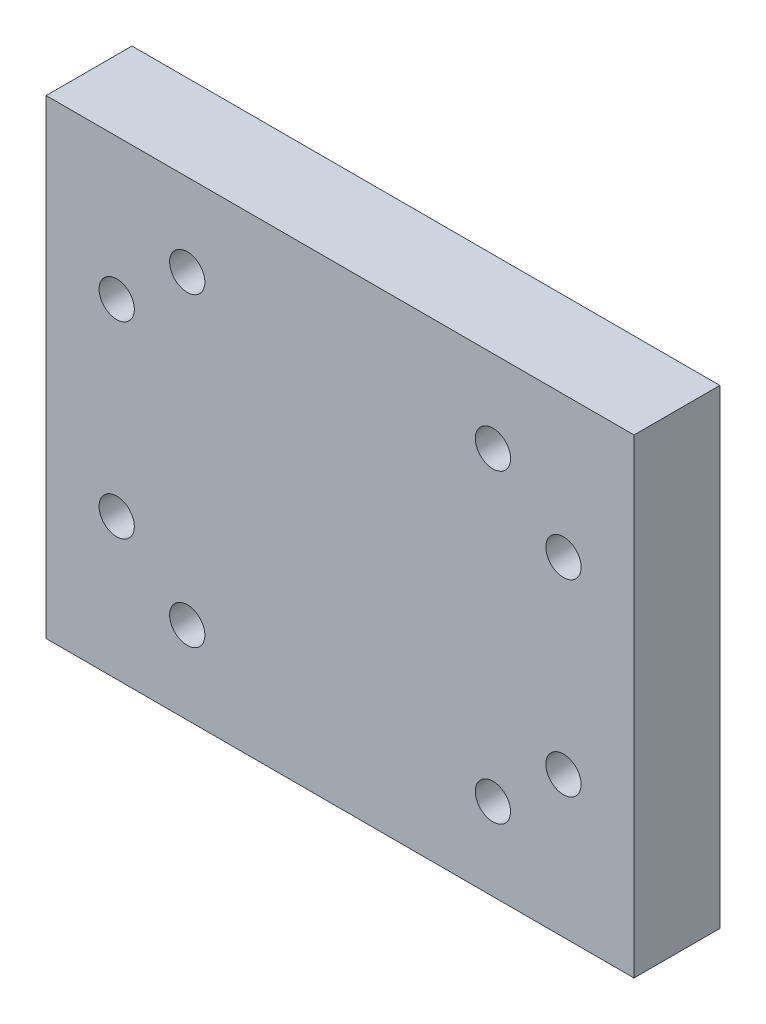
ISO-10303-21;
HEADER;
FILE_DESCRIPTION(('STEP AP214'),'2;1');
FILE_NAME('part.step','',(''),(''),'','','');
FILE_SCHEMA(('AUTOMOTIVE_DESIGN { 1 0 10303 214 1 1 1 1 }'));
ENDSEC;
DATA;
#1=APPLICATION_CONTEXT('core data for automotive mechanical design processes');
#2=APPLICATION_PROTOCOL_DEFINITION('international standard','automotive_design',2000,#1);
#3=PRODUCT_CONTEXT('',#1,'mechanical');
#4=PRODUCT('Part','Part','',(#3));
#5=PRODUCT_RELATED_PRODUCT_CATEGORY('part','',(#4));
#6=PRODUCT_DEFINITION_FORMATION('','',#4);
#7=PRODUCT_DEFINITION_CONTEXT('part definition',#1,'design');
#8=PRODUCT_DEFINITION('design','',#6,#7);
#9=PRODUCT_DEFINITION_SHAPE('','',#8);
#10=(LENGTH_UNIT() NAMED_UNIT(*) SI_UNIT(.MILLI.,.METRE.));
#11=(NAMED_UNIT(*) PLANE_ANGLE_UNIT() SI_UNIT($,.RADIAN.));
#12=(NAMED_UNIT(*) SI_UNIT($,.STERADIAN.) SOLID_ANGLE_UNIT());
#13=UNCERTAINTY_MEASURE_WITH_UNIT(LENGTH_MEASURE(1.E-05),#10,'distance_accuracy_value','');
#14=(GEOMETRIC_REPRESENTATION_CONTEXT(3) GLOBAL_UNCERTAINTY_ASSIGNED_CONTEXT((#13)) GLOBAL_UNIT_ASSIGNED_CONTEXT((#10,
#11,#12)) REPRESENTATION_CONTEXT('',''));
#15=CARTESIAN_POINT('',(0.,0.,0.));
#16=DIRECTION('',(0.,0.,1.));
#17=DIRECTION('',(1.,0.,0.));
#18=AXIS2_PLACEMENT_3D('',#15,#16,#17);
#19=CARTESIAN_POINT('',(0.,0.,7.3));
#20=DIRECTION('',(0.,0.,1.));
#21=DIRECTION('',(1.,0.,0.));
#22=AXIS2_PLACEMENT_3D('',#19,#20,#21);
#23=PLANE('',#22);
#24=CARTESIAN_POINT('',(-19.,-8.,7.3));
#25=DIRECTION('',(0.,0.,1.));
#26=DIRECTION('',(1.,0.,0.));
#27=AXIS2_PLACEMENT_3D('',#24,#25,#26);
#28=CIRCLE('',#27,1.5);
#29=CARTESIAN_POINT('',(-17.5,-8.,7.3));
#30=VERTEX_POINT('',#29);
#31=EDGE_CURVE('E133',#30,#30,#28,.T.);
#32=ORIENTED_EDGE('',*,*,#31,.F.);
#33=EDGE_LOOP('',(#32));
#34=FACE_BOUND('',#33,.T.);
#35=CARTESIAN_POINT('',(19.,-8.,7.3));
#36=DIRECTION('',(0.,0.,1.));
#37=DIRECTION('',(1.,0.,0.));
#38=AXIS2_PLACEMENT_3D('',#35,#36,#37);
#39=CIRCLE('',#38,1.5);
#40=CARTESIAN_POINT('',(20.5,-8.,7.3));
#41=VERTEX_POINT('',#40);
#42=EDGE_CURVE('E138',#41,#41,#39,.T.);
#43=ORIENTED_EDGE('',*,*,#42,.F.);
#44=EDGE_LOOP('',(#43));
#45=FACE_BOUND('',#44,.T.);
#46=CARTESIAN_POINT('',(19.,8.,7.3));
#47=DIRECTION('',(0.,0.,1.));
#48=DIRECTION('',(1.,0.,0.));
#49=AXIS2_PLACEMENT_3D('',#46,#47,#48);
#50=CIRCLE('',#49,1.5);
#51=CARTESIAN_POINT('',(20.5,8.,7.3));
#52=VERTEX_POINT('',#51);
#53=EDGE_CURVE('E141',#52,#52,#50,.T.);
#54=ORIENTED_EDGE('',*,*,#53,.F.);
#55=EDGE_LOOP('',(#54));
#56=FACE_BOUND('',#55,.T.);
#57=CARTESIAN_POINT('',(-19.,8.,7.3));
#58=DIRECTION('',(0.,0.,1.));
#59=DIRECTION('',(1.,0.,0.));
#60=AXIS2_PLACEMENT_3D('',#57,#58,#59);
#61=CIRCLE('',#60,1.5);
#62=CARTESIAN_POINT('',(-17.5,8.,7.3));
#63=VERTEX_POINT('',#62);
#64=EDGE_CURVE('E144',#63,#63,#61,.T.);
#65=ORIENTED_EDGE('',*,*,#64,.F.);
#66=EDGE_LOOP('',(#65));
#67=FACE_BOUND('',#66,.T.);
#68=CARTESIAN_POINT('',(13.,-13.,7.3));
#69=DIRECTION('',(0.,0.,1.));
#70=DIRECTION('',(1.,0.,0.));
#71=AXIS2_PLACEMENT_3D('',#68,#69,#70);
#72=CIRCLE('',#71,1.5);
#73=CARTESIAN_POINT('',(14.5,-13.,7.3));
#74=VERTEX_POINT('',#73);
#75=EDGE_CURVE('E121',#74,#74,#72,.T.);
#76=ORIENTED_EDGE('',*,*,#75,.F.);
#77=EDGE_LOOP('',(#76));
#78=FACE_BOUND('',#77,.T.);
#79=CARTESIAN_POINT('',(-13.,13.,7.3));
#80=DIRECTION('',(0.,0.,1.));
#81=DIRECTION('',(1.,0.,0.));
#82=AXIS2_PLACEMENT_3D('',#79,#80,#81);
#83=CIRCLE('',#82,1.5);
#84=CARTESIAN_POINT('',(-11.5,13.,7.3));
#85=VERTEX_POINT('',#84);
#86=EDGE_CURVE('E100',#85,#85,#83,.T.);
#87=ORIENTED_EDGE('',*,*,#86,.F.);
#88=EDGE_LOOP('',(#87));
#89=FACE_BOUND('',#88,.T.);
#90=DIRECTION('',(0.,-1.,0.));
#91=VECTOR('',#90,1.);
#92=CARTESIAN_POINT('',(-25.,-20.,7.3));
#93=LINE('',#92,#91);
#94=CARTESIAN_POINT('',(-25.,20.,7.3));
#95=VERTEX_POINT('',#94);
#96=CARTESIAN_POINT('',(-25.,-20.,7.3));
#97=VERTEX_POINT('',#96);
#98=EDGE_CURVE('E85',#95,#97,#93,.T.);
#99=ORIENTED_EDGE('',*,*,#98,.T.);
#100=DIRECTION('',(1.,0.,0.));
#101=VECTOR('',#100,1.);
#102=CARTESIAN_POINT('',(25.,-20.,7.3));
#103=LINE('',#102,#101);
#104=CARTESIAN_POINT('',(25.,-20.,7.3));
#105=VERTEX_POINT('',#104);
#106=EDGE_CURVE('E80',#97,#105,#103,.T.);
#107=ORIENTED_EDGE('',*,*,#106,.T.);
#108=DIRECTION('',(0.,1.,0.));
#109=VECTOR('',#108,1.);
#110=CARTESIAN_POINT('',(25.,-20.,7.3));
#111=LINE('',#110,#109);
#112=CARTESIAN_POINT('',(25.,20.,7.3));
#113=VERTEX_POINT('',#112);
#114=EDGE_CURVE('E83',#105,#113,#111,.T.);
#115=ORIENTED_EDGE('',*,*,#114,.T.);
#116=DIRECTION('',(-1.,0.,0.));
#117=VECTOR('',#116,1.);
#118=CARTESIAN_POINT('',(25.,20.,7.3));
#119=LINE('',#118,#117);
#120=EDGE_CURVE('E50',#113,#95,#119,.T.);
#121=ORIENTED_EDGE('',*,*,#120,.T.);
#122=EDGE_LOOP('',(#99,#107,#115,#121));
#123=FACE_BOUND('',#122,.T.);
#124=CARTESIAN_POINT('',(13.,13.,7.3));
#125=DIRECTION('',(0.,0.,1.));
#126=DIRECTION('',(-1.,0.,0.));
#127=AXIS2_PLACEMENT_3D('',#124,#125,#126);
#128=CIRCLE('',#127,1.5);
#129=CARTESIAN_POINT('',(11.5,13.,7.3));
#130=VERTEX_POINT('',#129);
#131=EDGE_CURVE('E115',#130,#130,#128,.T.);
#132=ORIENTED_EDGE('',*,*,#131,.F.);
#133=EDGE_LOOP('',(#132));
#134=FACE_BOUND('',#133,.T.);
#135=CARTESIAN_POINT('',(-13.,-13.,7.3));
#136=DIRECTION('',(0.,0.,1.));
#137=DIRECTION('',(-1.,0.,0.));
#138=AXIS2_PLACEMENT_3D('',#135,#136,#137);
#139=CIRCLE('',#138,1.5);
#140=CARTESIAN_POINT('',(-14.5,-13.,7.3));
#141=VERTEX_POINT('',#140);
#142=EDGE_CURVE('E127',#141,#141,#139,.T.);
#143=ORIENTED_EDGE('',*,*,#142,.F.);
#144=EDGE_LOOP('',(#143));
#145=FACE_BOUND('',#144,.T.);
#146=ADVANCED_FACE('F33',(#34,#45,#56,#67,#78,#89,#123,#134,#145),#23,.T.);
#147=CARTESIAN_POINT('',(0.,0.,0.));
#148=DIRECTION('',(0.,0.,1.));
#149=DIRECTION('',(1.,0.,0.));
#150=AXIS2_PLACEMENT_3D('',#147,#148,#149);
#151=PLANE('',#150);
#152=CARTESIAN_POINT('',(-19.,-8.,0.));
#153=DIRECTION('',(0.,0.,1.));
#154=DIRECTION('',(-1.,0.,0.));
#155=AXIS2_PLACEMENT_3D('',#152,#153,#154);
#156=CIRCLE('',#155,1.5);
#157=CARTESIAN_POINT('',(-20.5,-8.,0.));
#158=VERTEX_POINT('',#157);
#159=EDGE_CURVE('E151',#158,#158,#156,.T.);
#160=ORIENTED_EDGE('',*,*,#159,.T.);
#161=EDGE_LOOP('',(#160));
#162=FACE_BOUND('',#161,.T.);
#163=CARTESIAN_POINT('',(19.,-8.,0.));
#164=DIRECTION('',(0.,0.,1.));
#165=DIRECTION('',(1.,0.,0.));
#166=AXIS2_PLACEMENT_3D('',#163,#164,#165);
#167=CIRCLE('',#166,1.5);
#168=CARTESIAN_POINT('',(20.5,-8.,0.));
#169=VERTEX_POINT('',#168);
#170=EDGE_CURVE('E154',#169,#169,#167,.T.);
#171=ORIENTED_EDGE('',*,*,#170,.T.);
#172=EDGE_LOOP('',(#171));
#173=FACE_BOUND('',#172,.T.);
#174=CARTESIAN_POINT('',(19.,8.,0.));
#175=DIRECTION('',(0.,0.,1.));
#176=DIRECTION('',(-1.,0.,0.));
#177=AXIS2_PLACEMENT_3D('',#174,#175,#176);
#178=CIRCLE('',#177,1.5);
#179=CARTESIAN_POINT('',(17.5,8.,0.));
#180=VERTEX_POINT('',#179);
#181=EDGE_CURVE('E150',#180,#180,#178,.T.);
#182=ORIENTED_EDGE('',*,*,#181,.T.);
#183=EDGE_LOOP('',(#182));
#184=FACE_BOUND('',#183,.T.);
#185=CARTESIAN_POINT('',(-19.,8.,0.));
#186=DIRECTION('',(0.,0.,1.));
#187=DIRECTION('',(1.,0.,0.));
#188=AXIS2_PLACEMENT_3D('',#185,#186,#187);
#189=CIRCLE('',#188,1.5);
#190=CARTESIAN_POINT('',(-17.5,8.,0.));
#191=VERTEX_POINT('',#190);
#192=EDGE_CURVE('E147',#191,#191,#189,.T.);
#193=ORIENTED_EDGE('',*,*,#192,.T.);
#194=EDGE_LOOP('',(#193));
#195=FACE_BOUND('',#194,.T.);
#196=DIRECTION('',(0.,-1.,0.));
#197=VECTOR('',#196,1.);
#198=CARTESIAN_POINT('',(-25.,-20.,0.));
#199=LINE('',#198,#197);
#200=CARTESIAN_POINT('',(-25.,20.,0.));
#201=VERTEX_POINT('',#200);
#202=CARTESIAN_POINT('',(-25.,-20.,0.));
#203=VERTEX_POINT('',#202);
#204=EDGE_CURVE('E97',#201,#203,#199,.T.);
#205=ORIENTED_EDGE('',*,*,#204,.F.);
#206=DIRECTION('',(-1.,0.,0.));
#207=VECTOR('',#206,1.);
#208=CARTESIAN_POINT('',(25.,20.,0.));
#209=LINE('',#208,#207);
#210=CARTESIAN_POINT('',(25.,20.,0.));
#211=VERTEX_POINT('',#210);
#212=EDGE_CURVE('E73',#211,#201,#209,.T.);
#213=ORIENTED_EDGE('',*,*,#212,.F.);
#214=DIRECTION('',(0.,1.,0.));
#215=VECTOR('',#214,1.);
#216=CARTESIAN_POINT('',(25.,-20.,0.));
#217=LINE('',#216,#215);
#218=CARTESIAN_POINT('',(25.,-20.,0.));
#219=VERTEX_POINT('',#218);
#220=EDGE_CURVE('E67',#219,#211,#217,.T.);
#221=ORIENTED_EDGE('',*,*,#220,.F.);
#222=DIRECTION('',(1.,0.,0.));
#223=VECTOR('',#222,1.);
#224=CARTESIAN_POINT('',(25.,-20.,0.));
#225=LINE('',#224,#223);
#226=EDGE_CURVE('E89',#203,#219,#225,.T.);
#227=ORIENTED_EDGE('',*,*,#226,.F.);
#228=EDGE_LOOP('',(#205,#213,#221,#227));
#229=FACE_BOUND('',#228,.T.);
#230=CARTESIAN_POINT('',(-13.,13.,0.));
#231=DIRECTION('',(0.,0.,1.));
#232=DIRECTION('',(1.,0.,0.));
#233=AXIS2_PLACEMENT_3D('',#230,#231,#232);
#234=CIRCLE('',#233,1.5);
#235=CARTESIAN_POINT('',(-11.5,13.,0.));
#236=VERTEX_POINT('',#235);
#237=EDGE_CURVE('E112',#236,#236,#234,.T.);
#238=ORIENTED_EDGE('',*,*,#237,.T.);
#239=EDGE_LOOP('',(#238));
#240=FACE_BOUND('',#239,.T.);
#241=CARTESIAN_POINT('',(13.,13.,0.));
#242=DIRECTION('',(0.,0.,1.));
#243=DIRECTION('',(-1.,0.,0.));
#244=AXIS2_PLACEMENT_3D('',#241,#242,#243);
#245=CIRCLE('',#244,1.5);
#246=CARTESIAN_POINT('',(11.5,13.,0.));
#247=VERTEX_POINT('',#246);
#248=EDGE_CURVE('E118',#247,#247,#245,.T.);
#249=ORIENTED_EDGE('',*,*,#248,.T.);
#250=EDGE_LOOP('',(#249));
#251=FACE_BOUND('',#250,.T.);
#252=CARTESIAN_POINT('',(13.,-13.,0.));
#253=DIRECTION('',(0.,0.,1.));
#254=DIRECTION('',(1.,0.,0.));
#255=AXIS2_PLACEMENT_3D('',#252,#253,#254);
#256=CIRCLE('',#255,1.5);
#257=CARTESIAN_POINT('',(14.5,-13.,0.));
#258=VERTEX_POINT('',#257);
#259=EDGE_CURVE('E124',#258,#258,#256,.T.);
#260=ORIENTED_EDGE('',*,*,#259,.T.);
#261=EDGE_LOOP('',(#260));
#262=FACE_BOUND('',#261,.T.);
#263=CARTESIAN_POINT('',(-13.,-13.,0.));
#264=DIRECTION('',(0.,0.,1.));
#265=DIRECTION('',(-1.,0.,0.));
#266=AXIS2_PLACEMENT_3D('',#263,#264,#265);
#267=CIRCLE('',#266,1.5);
#268=CARTESIAN_POINT('',(-14.5,-13.,0.));
#269=VERTEX_POINT('',#268);
#270=EDGE_CURVE('E130',#269,#269,#267,.T.);
#271=ORIENTED_EDGE('',*,*,#270,.T.);
#272=EDGE_LOOP('',(#271));
#273=FACE_BOUND('',#272,.T.);
#274=ADVANCED_FACE('F108',(#162,#173,#184,#195,#229,#240,#251,#262,#273),#151,.F.);
#275=CARTESIAN_POINT('',(-25.,-20.,7.3));
#276=DIRECTION('',(1.,0.,0.));
#277=DIRECTION('',(0.,1.,0.));
#278=AXIS2_PLACEMENT_3D('',#275,#276,#277);
#279=PLANE('',#278);
#280=ORIENTED_EDGE('',*,*,#204,.T.);
#281=DIRECTION('',(0.,0.,-1.));
#282=VECTOR('',#281,1.);
#283=CARTESIAN_POINT('',(-25.,-20.,7.3));
#284=LINE('',#283,#282);
#285=EDGE_CURVE('E11',#97,#203,#284,.T.);
#286=ORIENTED_EDGE('',*,*,#285,.F.);
#287=ORIENTED_EDGE('',*,*,#98,.F.);
#288=DIRECTION('',(0.,0.,-1.));
#289=VECTOR('',#288,1.);
#290=CARTESIAN_POINT('',(-25.,20.,7.3));
#291=LINE('',#290,#289);
#292=EDGE_CURVE('E93',#95,#201,#291,.T.);
#293=ORIENTED_EDGE('',*,*,#292,.T.);
#294=EDGE_LOOP('',(#280,#286,#287,#293));
#295=FACE_BOUND('',#294,.T.);
#296=ADVANCED_FACE('F35',(#295),#279,.F.);
#297=CARTESIAN_POINT('',(25.,-20.,7.3));
#298=DIRECTION('',(0.,1.,0.));
#299=DIRECTION('',(-1.,0.,0.));
#300=AXIS2_PLACEMENT_3D('',#297,#298,#299);
#301=PLANE('',#300);
#302=ORIENTED_EDGE('',*,*,#226,.T.);
#303=DIRECTION('',(0.,0.,-1.));
#304=VECTOR('',#303,1.);
#305=CARTESIAN_POINT('',(25.,-20.,7.3));
#306=LINE('',#305,#304);
#307=EDGE_CURVE('E42',#105,#219,#306,.T.);
#308=ORIENTED_EDGE('',*,*,#307,.F.);
#309=ORIENTED_EDGE('',*,*,#106,.F.);
#310=ORIENTED_EDGE('',*,*,#285,.T.);
#311=EDGE_LOOP('',(#302,#308,#309,#310));
#312=FACE_BOUND('',#311,.T.);
#313=ADVANCED_FACE('F88',(#312),#301,.F.);
#314=CARTESIAN_POINT('',(25.,-20.,7.3));
#315=DIRECTION('',(-1.,0.,0.));
#316=DIRECTION('',(0.,-1.,0.));
#317=AXIS2_PLACEMENT_3D('',#314,#315,#316);
#318=PLANE('',#317);
#319=ORIENTED_EDGE('',*,*,#220,.T.);
#320=DIRECTION('',(0.,0.,-1.));
#321=VECTOR('',#320,1.);
#322=CARTESIAN_POINT('',(25.,20.,7.3));
#323=LINE('',#322,#321);
#324=EDGE_CURVE('E90',#113,#211,#323,.T.);
#325=ORIENTED_EDGE('',*,*,#324,.F.);
#326=ORIENTED_EDGE('',*,*,#114,.F.);
#327=ORIENTED_EDGE('',*,*,#307,.T.);
#328=EDGE_LOOP('',(#319,#325,#326,#327));
#329=FACE_BOUND('',#328,.T.);
#330=ADVANCED_FACE('F91',(#329),#318,.F.);
#331=CARTESIAN_POINT('',(25.,20.,7.3));
#332=DIRECTION('',(0.,-1.,0.));
#333=DIRECTION('',(1.,0.,0.));
#334=AXIS2_PLACEMENT_3D('',#331,#332,#333);
#335=PLANE('',#334);
#336=ORIENTED_EDGE('',*,*,#212,.T.);
#337=ORIENTED_EDGE('',*,*,#292,.F.);
#338=ORIENTED_EDGE('',*,*,#120,.F.);
#339=ORIENTED_EDGE('',*,*,#324,.T.);
#340=EDGE_LOOP('',(#336,#337,#338,#339));
#341=FACE_BOUND('',#340,.T.);
#342=ADVANCED_FACE('F105',(#341),#335,.F.);
#343=CARTESIAN_POINT('',(-13.,13.,7.3));
#344=DIRECTION('',(0.,0.,-1.));
#345=DIRECTION('',(-1.,0.,0.));
#346=AXIS2_PLACEMENT_3D('',#343,#344,#345);
#347=CYLINDRICAL_SURFACE('',#346,1.5);
#348=ORIENTED_EDGE('',*,*,#86,.T.);
#349=EDGE_LOOP('',(#348));
#350=FACE_BOUND('',#349,.T.);
#351=ORIENTED_EDGE('',*,*,#237,.F.);
#352=EDGE_LOOP('',(#351));
#353=FACE_BOUND('',#352,.T.);
#354=ADVANCED_FACE('F189',(#350,#353),#347,.F.);
#355=CARTESIAN_POINT('',(13.,13.,7.3));
#356=DIRECTION('',(0.,0.,-1.));
#357=DIRECTION('',(-1.,0.,0.));
#358=AXIS2_PLACEMENT_3D('',#355,#356,#357);
#359=CYLINDRICAL_SURFACE('',#358,1.5);
#360=ORIENTED_EDGE('',*,*,#131,.T.);
#361=EDGE_LOOP('',(#360));
#362=FACE_BOUND('',#361,.T.);
#363=ORIENTED_EDGE('',*,*,#248,.F.);
#364=EDGE_LOOP('',(#363));
#365=FACE_BOUND('',#364,.T.);
#366=ADVANCED_FACE('F245',(#362,#365),#359,.F.);
#367=CARTESIAN_POINT('',(13.,-13.,7.3));
#368=DIRECTION('',(0.,0.,-1.));
#369=DIRECTION('',(-1.,0.,0.));
#370=AXIS2_PLACEMENT_3D('',#367,#368,#369);
#371=CYLINDRICAL_SURFACE('',#370,1.5);
#372=ORIENTED_EDGE('',*,*,#75,.T.);
#373=EDGE_LOOP('',(#372));
#374=FACE_BOUND('',#373,.T.);
#375=ORIENTED_EDGE('',*,*,#259,.F.);
#376=EDGE_LOOP('',(#375));
#377=FACE_BOUND('',#376,.T.);
#378=ADVANCED_FACE('F242',(#374,#377),#371,.F.);
#379=CARTESIAN_POINT('',(-13.,-13.,7.3));
#380=DIRECTION('',(0.,0.,-1.));
#381=DIRECTION('',(-1.,0.,0.));
#382=AXIS2_PLACEMENT_3D('',#379,#380,#381);
#383=CYLINDRICAL_SURFACE('',#382,1.5);
#384=ORIENTED_EDGE('',*,*,#142,.T.);
#385=EDGE_LOOP('',(#384));
#386=FACE_BOUND('',#385,.T.);
#387=ORIENTED_EDGE('',*,*,#270,.F.);
#388=EDGE_LOOP('',(#387));
#389=FACE_BOUND('',#388,.T.);
#390=ADVANCED_FACE('F175',(#386,#389),#383,.F.);
#391=CARTESIAN_POINT('',(-19.,8.,0.));
#392=DIRECTION('',(0.,0.,1.));
#393=DIRECTION('',(1.,0.,0.));
#394=AXIS2_PLACEMENT_3D('',#391,#392,#393);
#395=CYLINDRICAL_SURFACE('',#394,1.5);
#396=ORIENTED_EDGE('',*,*,#64,.T.);
#397=EDGE_LOOP('',(#396));
#398=FACE_BOUND('',#397,.T.);
#399=ORIENTED_EDGE('',*,*,#192,.F.);
#400=EDGE_LOOP('',(#399));
#401=FACE_BOUND('',#400,.T.);
#402=ADVANCED_FACE('F165',(#398,#401),#395,.F.);
#403=CARTESIAN_POINT('',(19.,8.,0.));
#404=DIRECTION('',(0.,0.,1.));
#405=DIRECTION('',(1.,0.,0.));
#406=AXIS2_PLACEMENT_3D('',#403,#404,#405);
#407=CYLINDRICAL_SURFACE('',#406,1.5);
#408=ORIENTED_EDGE('',*,*,#53,.T.);
#409=EDGE_LOOP('',(#408));
#410=FACE_BOUND('',#409,.T.);
#411=ORIENTED_EDGE('',*,*,#181,.F.);
#412=EDGE_LOOP('',(#411));
#413=FACE_BOUND('',#412,.T.);
#414=ADVANCED_FACE('F162',(#410,#413),#407,.F.);
#415=CARTESIAN_POINT('',(19.,-8.,0.));
#416=DIRECTION('',(0.,0.,1.));
#417=DIRECTION('',(1.,0.,0.));
#418=AXIS2_PLACEMENT_3D('',#415,#416,#417);
#419=CYLINDRICAL_SURFACE('',#418,1.5);
#420=ORIENTED_EDGE('',*,*,#42,.T.);
#421=EDGE_LOOP('',(#420));
#422=FACE_BOUND('',#421,.T.);
#423=ORIENTED_EDGE('',*,*,#170,.F.);
#424=EDGE_LOOP('',(#423));
#425=FACE_BOUND('',#424,.T.);
#426=ADVANCED_FACE('F164',(#422,#425),#419,.F.);
#427=CARTESIAN_POINT('',(-19.,-8.,0.));
#428=DIRECTION('',(0.,0.,1.));
#429=DIRECTION('',(1.,0.,0.));
#430=AXIS2_PLACEMENT_3D('',#427,#428,#429);
#431=CYLINDRICAL_SURFACE('',#430,1.5);
#432=ORIENTED_EDGE('',*,*,#31,.T.);
#433=EDGE_LOOP('',(#432));
#434=FACE_BOUND('',#433,.T.);
#435=ORIENTED_EDGE('',*,*,#159,.F.);
#436=EDGE_LOOP('',(#435));
#437=FACE_BOUND('',#436,.T.);
#438=ADVANCED_FACE('F172',(#434,#437),#431,.F.);
#439=CLOSED_SHELL('',(#146,#274,#296,#313,#330,#342,#354,#366,#378,#390,#402,#414,#426,#438));
#440=MANIFOLD_SOLID_BREP('B2',#439);
#441=ADVANCED_BREP_SHAPE_REPRESENTATION('',(#18,#440),#14);
#442=SHAPE_DEFINITION_REPRESENTATION(#9,#441);
ENDSEC;
END-ISO-10303-21;
